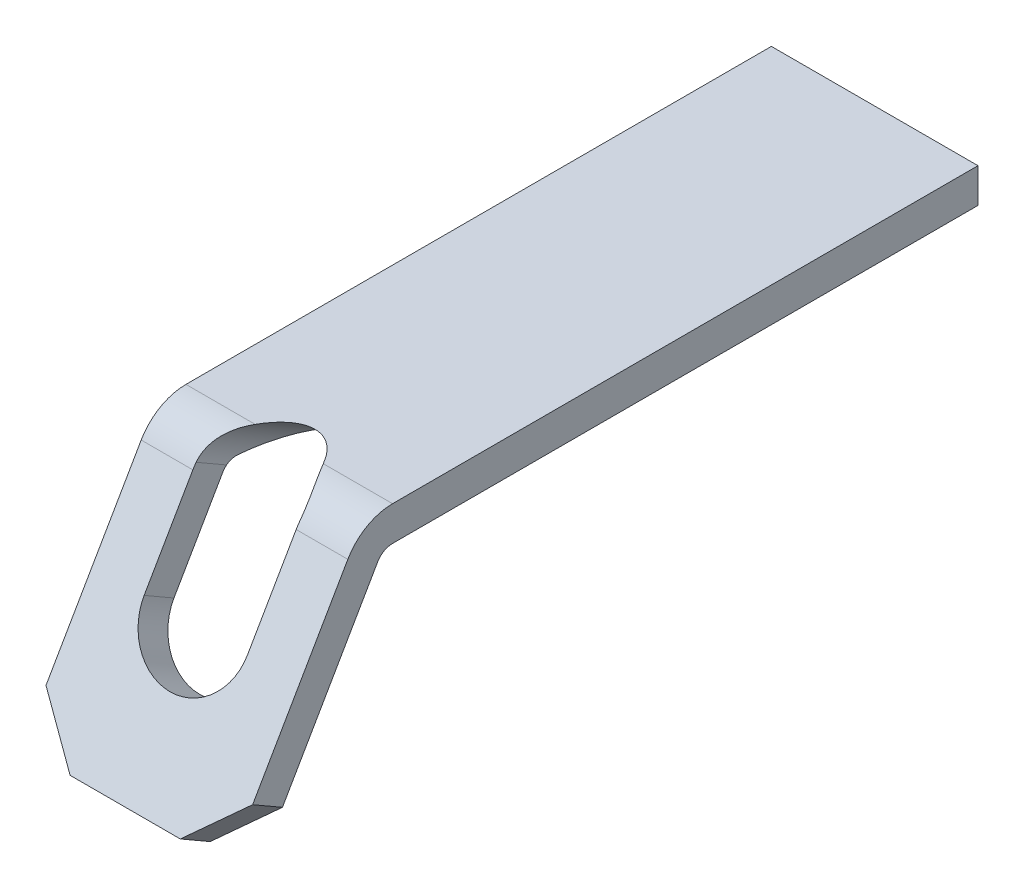
ISO-10303-21;
HEADER;
FILE_DESCRIPTION(('STEP AP214'),'2;1');
FILE_NAME('part.step','',(''),(''),'','','');
FILE_SCHEMA(('AUTOMOTIVE_DESIGN { 1 0 10303 214 1 1 1 1 }'));
ENDSEC;
DATA;
#1=APPLICATION_CONTEXT('core data for automotive mechanical design processes');
#2=APPLICATION_PROTOCOL_DEFINITION('international standard','automotive_design',2000,#1);
#3=PRODUCT_CONTEXT('',#1,'mechanical');
#4=PRODUCT('Part','Part','',(#3));
#5=PRODUCT_RELATED_PRODUCT_CATEGORY('part','',(#4));
#6=PRODUCT_DEFINITION_FORMATION('','',#4);
#7=PRODUCT_DEFINITION_CONTEXT('part definition',#1,'design');
#8=PRODUCT_DEFINITION('design','',#6,#7);
#9=PRODUCT_DEFINITION_SHAPE('','',#8);
#10=(LENGTH_UNIT() NAMED_UNIT(*) SI_UNIT(.MILLI.,.METRE.));
#11=(NAMED_UNIT(*) PLANE_ANGLE_UNIT() SI_UNIT($,.RADIAN.));
#12=(NAMED_UNIT(*) SI_UNIT($,.STERADIAN.) SOLID_ANGLE_UNIT());
#13=UNCERTAINTY_MEASURE_WITH_UNIT(LENGTH_MEASURE(1.E-05),#10,'distance_accuracy_value','');
#14=(GEOMETRIC_REPRESENTATION_CONTEXT(3) GLOBAL_UNCERTAINTY_ASSIGNED_CONTEXT((#13)) GLOBAL_UNIT_ASSIGNED_CONTEXT((#10,
#11,#12)) REPRESENTATION_CONTEXT('',''));
#15=CARTESIAN_POINT('',(0.,0.,0.));
#16=DIRECTION('',(0.,0.,1.));
#17=DIRECTION('',(1.,0.,0.));
#18=AXIS2_PLACEMENT_3D('',#15,#16,#17);
#19=CARTESIAN_POINT('',(1.5,-0.125,4.89951905283833));
#20=DIRECTION('',(0.,0.500000000000001,0.866025403784438));
#21=DIRECTION('',(0.,-0.866025403784438,0.500000000000001));
#22=AXIS2_PLACEMENT_3D('',#19,#20,#21);
#23=PLANE('',#22);
#24=DIRECTION('',(0.,0.866025403784438,-0.500000000000001));
#25=VECTOR('',#24,1.);
#26=CARTESIAN_POINT('',(-1.5,-2.51878221735089,6.28156986040721));
#27=LINE('',#26,#25);
#28=CARTESIAN_POINT('',(-1.5,-2.51878221735089,6.28156986040721));
#29=VERTEX_POINT('',#28);
#30=CARTESIAN_POINT('',(-1.5,-0.125,4.89951905283833));
#31=VERTEX_POINT('',#30);
#32=EDGE_CURVE('E139',#29,#31,#27,.T.);
#33=ORIENTED_EDGE('',*,*,#32,.F.);
#34=DIRECTION('',(0.707106781186546,-0.612372435695796,0.353553390593275));
#35=VECTOR('',#34,1.);
#36=CARTESIAN_POINT('',(-1.5,-2.51878221735089,6.28156986040721));
#37=LINE('',#36,#35);
#38=CARTESIAN_POINT('',(-0.799999999999998,-3.125,6.63156986040721));
#39=VERTEX_POINT('',#38);
#40=EDGE_CURVE('E153',#29,#39,#37,.T.);
#41=ORIENTED_EDGE('',*,*,#40,.T.);
#42=DIRECTION('',(1.,0.,0.));
#43=VECTOR('',#42,1.);
#44=CARTESIAN_POINT('',(0.,-3.125,6.63156986040721));
#45=LINE('',#44,#43);
#46=CARTESIAN_POINT('',(0.8,-3.125,6.63156986040721));
#47=VERTEX_POINT('',#46);
#48=EDGE_CURVE('E160',#47,#39,#45,.F.);
#49=ORIENTED_EDGE('',*,*,#48,.F.);
#50=DIRECTION('',(0.707106781186546,0.612372435695795,-0.353553390593276));
#51=VECTOR('',#50,1.);
#52=CARTESIAN_POINT('',(0.8,-3.125,6.63156986040721));
#53=LINE('',#52,#51);
#54=CARTESIAN_POINT('',(1.5,-2.51878221735089,6.28156986040721));
#55=VERTEX_POINT('',#54);
#56=EDGE_CURVE('E166',#47,#55,#53,.T.);
#57=ORIENTED_EDGE('',*,*,#56,.T.);
#58=DIRECTION('',(0.,-0.866025403784438,0.500000000000001));
#59=VECTOR('',#58,1.);
#60=CARTESIAN_POINT('',(1.5,-0.125000000000001,4.89951905283833));
#61=LINE('',#60,#59);
#62=CARTESIAN_POINT('',(1.5,-0.125,4.89951905283833));
#63=VERTEX_POINT('',#62);
#64=EDGE_CURVE('E152',#63,#55,#61,.T.);
#65=ORIENTED_EDGE('',*,*,#64,.F.);
#66=DIRECTION('',(1.,0.,0.));
#67=VECTOR('',#66,1.);
#68=CARTESIAN_POINT('',(1.5,-0.125000000000001,4.89951905283833));
#69=LINE('',#68,#67);
#70=CARTESIAN_POINT('',(0.75,-0.125,4.89951905283833));
#71=VERTEX_POINT('',#70);
#72=EDGE_CURVE('E144',#63,#71,#69,.F.);
#73=ORIENTED_EDGE('',*,*,#72,.T.);
#74=DIRECTION('',(0.,-0.866025403784438,0.500000000000001));
#75=VECTOR('',#74,1.);
#76=CARTESIAN_POINT('',(0.75,-0.125,4.89951905283833));
#77=LINE('',#76,#75);
#78=CARTESIAN_POINT('',(0.75,-1.3496479222419,5.60656986040721));
#79=VERTEX_POINT('',#78);
#80=EDGE_CURVE('E129',#71,#79,#77,.T.);
#81=ORIENTED_EDGE('',*,*,#80,.T.);
#82=CARTESIAN_POINT('',(0.,-1.3496479222419,5.60656986040721));
#83=DIRECTION('',(0.,0.500000000000001,0.866025403784438));
#84=DIRECTION('',(0.,-0.866025403784438,0.500000000000001));
#85=AXIS2_PLACEMENT_3D('',#82,#83,#84);
#86=CIRCLE('',#85,0.75);
#87=CARTESIAN_POINT('',(-0.75,-1.3496479222419,5.60656986040721));
#88=VERTEX_POINT('',#87);
#89=EDGE_CURVE('E20',#79,#88,#86,.F.);
#90=ORIENTED_EDGE('',*,*,#89,.T.);
#91=DIRECTION('',(0.,-0.866025403784438,0.500000000000001));
#92=VECTOR('',#91,1.);
#93=CARTESIAN_POINT('',(-0.75,-0.125,4.89951905283833));
#94=LINE('',#93,#92);
#95=CARTESIAN_POINT('',(-0.75,-0.125,4.89951905283833));
#96=VERTEX_POINT('',#95);
#97=EDGE_CURVE('E117',#88,#96,#94,.F.);
#98=ORIENTED_EDGE('',*,*,#97,.T.);
#99=DIRECTION('',(1.,0.,0.));
#100=VECTOR('',#99,1.);
#101=CARTESIAN_POINT('',(1.5,-0.125000000000001,4.89951905283833));
#102=LINE('',#101,#100);
#103=EDGE_CURVE('E150',#96,#31,#102,.F.);
#104=ORIENTED_EDGE('',*,*,#103,.T.);
#105=EDGE_LOOP('',(#33,#41,#49,#57,#65,#73,#81,#90,#98,#104));
#106=FACE_BOUND('',#105,.T.);
#107=ADVANCED_FACE('F17',(#106),#23,.T.);
#108=CARTESIAN_POINT('',(0.8,-3.25,6.4150635094611));
#109=DIRECTION('',(-0.707106781186549,0.612372435695793,-0.353553390593274));
#110=DIRECTION('',(-0.654653670707975,-0.755928946018456,0.));
#111=AXIS2_PLACEMENT_3D('',#108,#109,#110);
#112=PLANE('',#111);
#113=DIRECTION('',(0.,-0.500000000000001,-0.866025403784438));
#114=VECTOR('',#113,1.);
#115=CARTESIAN_POINT('',(1.5,-2.51878221735089,6.28156986040721));
#116=LINE('',#115,#114);
#117=CARTESIAN_POINT('',(1.5,-2.76878221735089,5.84855715851499));
#118=VERTEX_POINT('',#117);
#119=EDGE_CURVE('E169',#55,#118,#116,.T.);
#120=ORIENTED_EDGE('',*,*,#119,.F.);
#121=ORIENTED_EDGE('',*,*,#56,.F.);
#122=DIRECTION('',(0.,-0.500000000000001,-0.866025403784438));
#123=VECTOR('',#122,1.);
#124=CARTESIAN_POINT('',(0.8,-3.25,6.4150635094611));
#125=LINE('',#124,#123);
#126=CARTESIAN_POINT('',(0.799999999999999,-3.375,6.198557158515));
#127=VERTEX_POINT('',#126);
#128=EDGE_CURVE('E163',#127,#47,#125,.F.);
#129=ORIENTED_EDGE('',*,*,#128,.F.);
#130=DIRECTION('',(-0.707106781186546,-0.612372435695796,0.353553390593275));
#131=VECTOR('',#130,1.);
#132=CARTESIAN_POINT('',(1.5,-2.76878221735089,5.84855715851499));
#133=LINE('',#132,#131);
#134=EDGE_CURVE('E296',#118,#127,#133,.T.);
#135=ORIENTED_EDGE('',*,*,#134,.F.);
#136=EDGE_LOOP('',(#120,#121,#129,#135));
#137=FACE_BOUND('',#136,.T.);
#138=ADVANCED_FACE('F338',(#137),#112,.F.);
#139=CARTESIAN_POINT('',(0.,-3.25,6.4150635094611));
#140=DIRECTION('',(0.,-0.866025403784438,0.500000000000001));
#141=DIRECTION('',(0.,-0.500000000000001,-0.866025403784438));
#142=AXIS2_PLACEMENT_3D('',#139,#140,#141);
#143=PLANE('',#142);
#144=ORIENTED_EDGE('',*,*,#48,.T.);
#145=DIRECTION('',(0.,-0.500000000000001,-0.866025403784438));
#146=VECTOR('',#145,1.);
#147=CARTESIAN_POINT('',(-0.799999999999998,-3.125,6.63156986040721));
#148=LINE('',#147,#146);
#149=CARTESIAN_POINT('',(-0.799999999999998,-3.375,6.198557158515));
#150=VERTEX_POINT('',#149);
#151=EDGE_CURVE('E157',#39,#150,#148,.T.);
#152=ORIENTED_EDGE('',*,*,#151,.T.);
#153=DIRECTION('',(1.,0.,0.));
#154=VECTOR('',#153,1.);
#155=CARTESIAN_POINT('',(-1.5,-3.375,6.198557158515));
#156=LINE('',#155,#154);
#157=EDGE_CURVE('E287',#127,#150,#156,.F.);
#158=ORIENTED_EDGE('',*,*,#157,.F.);
#159=ORIENTED_EDGE('',*,*,#128,.T.);
#160=EDGE_LOOP('',(#144,#152,#158,#159));
#161=FACE_BOUND('',#160,.T.);
#162=ADVANCED_FACE('F418',(#161),#143,.T.);
#163=CARTESIAN_POINT('',(-0.799999999999998,-3.25,6.4150635094611));
#164=DIRECTION('',(0.707106781186549,0.612372435695793,-0.353553390593274));
#165=DIRECTION('',(-0.654653670707975,0.755928946018456,0.));
#166=AXIS2_PLACEMENT_3D('',#163,#164,#165);
#167=PLANE('',#166);
#168=DIRECTION('',(0.,0.500000000000001,0.866025403784438));
#169=VECTOR('',#168,1.);
#170=CARTESIAN_POINT('',(-1.5,-2.76878221735089,5.84855715851499));
#171=LINE('',#170,#169);
#172=CARTESIAN_POINT('',(-1.5,-2.76878221735089,5.84855715851499));
#173=VERTEX_POINT('',#172);
#174=EDGE_CURVE('E156',#173,#29,#171,.T.);
#175=ORIENTED_EDGE('',*,*,#174,.F.);
#176=DIRECTION('',(-0.707106781186545,0.612372435695796,-0.353553390593275));
#177=VECTOR('',#176,1.);
#178=CARTESIAN_POINT('',(-0.799999999999998,-3.375,6.198557158515));
#179=LINE('',#178,#177);
#180=EDGE_CURVE('E284',#150,#173,#179,.T.);
#181=ORIENTED_EDGE('',*,*,#180,.F.);
#182=ORIENTED_EDGE('',*,*,#151,.F.);
#183=ORIENTED_EDGE('',*,*,#40,.F.);
#184=EDGE_LOOP('',(#175,#181,#182,#183));
#185=FACE_BOUND('',#184,.T.);
#186=ADVANCED_FACE('F416',(#185),#167,.F.);
#187=CARTESIAN_POINT('',(0.75,-4.82496778264912,-3.41286071037125));
#188=DIRECTION('',(1.,0.,0.));
#189=DIRECTION('',(0.,0.,-1.));
#190=AXIS2_PLACEMENT_3D('',#187,#188,#189);
#191=PLANE('',#190);
#192=DIRECTION('',(0.,0.5,0.866025403784439));
#193=VECTOR('',#192,1.);
#194=CARTESIAN_POINT('',(0.75,-0.308220009215908,4.41037591818866));
#195=LINE('',#194,#193);
#196=CARTESIAN_POINT('',(0.75,-0.308220009215908,4.41037591818866));
#197=VERTEX_POINT('',#196);
#198=CARTESIAN_POINT('',(0.75,-0.0530774463347996,4.85229580027207));
#199=VERTEX_POINT('',#198);
#200=EDGE_CURVE('E271',#197,#199,#195,.T.);
#201=ORIENTED_EDGE('',*,*,#200,.F.);
#202=CARTESIAN_POINT('',(0.75,-0.5,4.25));
#203=DIRECTION('',(1.,0.,0.));
#204=DIRECTION('',(0.,0.,-1.));
#205=AXIS2_PLACEMENT_3D('',#202,#203,#204);
#206=CIRCLE('',#205,0.25);
#207=CARTESIAN_POINT('',(0.75,-0.375,4.46650635094611));
#208=VERTEX_POINT('',#207);
#209=EDGE_CURVE('E138',#208,#197,#206,.F.);
#210=ORIENTED_EDGE('',*,*,#209,.F.);
#211=DIRECTION('',(0.,0.866025403784438,-0.500000000000001));
#212=VECTOR('',#211,1.);
#213=CARTESIAN_POINT('',(0.75,-0.375,4.46650635094611));
#214=LINE('',#213,#212);
#215=CARTESIAN_POINT('',(0.75,-1.5996479222419,5.17355715851499));
#216=VERTEX_POINT('',#215);
#217=EDGE_CURVE('E136',#216,#208,#214,.T.);
#218=ORIENTED_EDGE('',*,*,#217,.F.);
#219=DIRECTION('',(0.,-0.500000000000002,-0.866025403784438));
#220=VECTOR('',#219,1.);
#221=CARTESIAN_POINT('',(0.75,-1.3496479222419,5.60656986040721));
#222=LINE('',#221,#220);
#223=EDGE_CURVE('E124',#79,#216,#222,.T.);
#224=ORIENTED_EDGE('',*,*,#223,.F.);
#225=ORIENTED_EDGE('',*,*,#80,.F.);
#226=CARTESIAN_POINT('',(0.75,-0.5,4.25));
#227=DIRECTION('',(1.,0.,0.));
#228=DIRECTION('',(0.,0.,-1.));
#229=AXIS2_PLACEMENT_3D('',#226,#227,#228);
#230=CIRCLE('',#229,0.75);
#231=EDGE_CURVE('E269',#199,#71,#230,.T.);
#232=ORIENTED_EDGE('',*,*,#231,.F.);
#233=EDGE_LOOP('',(#201,#210,#218,#224,#225,#232));
#234=FACE_BOUND('',#233,.T.);
#235=ADVANCED_FACE('F132',(#234),#191,.F.);
#236=CARTESIAN_POINT('',(0.,-6.12400588832578,-2.66286071037124));
#237=DIRECTION('',(0.,0.500000000000001,0.866025403784438));
#238=DIRECTION('',(0.,-0.866025403784438,0.500000000000001));
#239=AXIS2_PLACEMENT_3D('',#236,#237,#238);
#240=CYLINDRICAL_SURFACE('',#239,0.75);
#241=CARTESIAN_POINT('',(0.,-1.5996479222419,5.17355715851499));
#242=DIRECTION('',(0.,0.500000000000001,0.866025403784438));
#243=DIRECTION('',(0.,-0.866025403784438,0.500000000000001));
#244=AXIS2_PLACEMENT_3D('',#241,#242,#243);
#245=CIRCLE('',#244,0.75);
#246=CARTESIAN_POINT('',(-0.75,-1.5996479222419,5.17355715851499));
#247=VERTEX_POINT('',#246);
#248=EDGE_CURVE('E266',#247,#216,#245,.T.);
#249=ORIENTED_EDGE('',*,*,#248,.F.);
#250=DIRECTION('',(0.,0.5,0.866025403784438));
#251=VECTOR('',#250,1.);
#252=CARTESIAN_POINT('',(-0.75,-1.5996479222419,5.17355715851499));
#253=LINE('',#252,#251);
#254=EDGE_CURVE('E126',#247,#88,#253,.T.);
#255=ORIENTED_EDGE('',*,*,#254,.T.);
#256=ORIENTED_EDGE('',*,*,#89,.F.);
#257=ORIENTED_EDGE('',*,*,#223,.T.);
#258=EDGE_LOOP('',(#249,#255,#256,#257));
#259=FACE_BOUND('',#258,.T.);
#260=ADVANCED_FACE('F123',(#259),#240,.F.);
#261=CARTESIAN_POINT('',(-1.5,-0.375,4.46650635094611));
#262=DIRECTION('',(0.,-0.500000000000001,-0.866025403784438));
#263=DIRECTION('',(0.,0.866025403784438,-0.500000000000001));
#264=AXIS2_PLACEMENT_3D('',#261,#262,#263);
#265=PLANE('',#264);
#266=ORIENTED_EDGE('',*,*,#217,.T.);
#267=DIRECTION('',(1.,0.,0.));
#268=VECTOR('',#267,1.);
#269=CARTESIAN_POINT('',(0.,-0.375,4.46650635094611));
#270=LINE('',#269,#268);
#271=CARTESIAN_POINT('',(1.5,-0.375,4.46650635094611));
#272=VERTEX_POINT('',#271);
#273=EDGE_CURVE('E225',#208,#272,#270,.T.);
#274=ORIENTED_EDGE('',*,*,#273,.T.);
#275=DIRECTION('',(0.,0.866025403784438,-0.500000000000001));
#276=VECTOR('',#275,1.);
#277=CARTESIAN_POINT('',(1.5,-0.375,4.46650635094611));
#278=LINE('',#277,#276);
#279=EDGE_CURVE('E270',#272,#118,#278,.F.);
#280=ORIENTED_EDGE('',*,*,#279,.T.);
#281=ORIENTED_EDGE('',*,*,#134,.T.);
#282=ORIENTED_EDGE('',*,*,#157,.T.);
#283=ORIENTED_EDGE('',*,*,#180,.T.);
#284=DIRECTION('',(0.,0.866025403784438,-0.500000000000001));
#285=VECTOR('',#284,1.);
#286=CARTESIAN_POINT('',(-1.5,-0.375,4.46650635094611));
#287=LINE('',#286,#285);
#288=CARTESIAN_POINT('',(-1.5,-0.375,4.46650635094611));
#289=VERTEX_POINT('',#288);
#290=EDGE_CURVE('E268',#173,#289,#287,.T.);
#291=ORIENTED_EDGE('',*,*,#290,.T.);
#292=DIRECTION('',(1.,0.,0.));
#293=VECTOR('',#292,1.);
#294=CARTESIAN_POINT('',(0.,-0.375,4.46650635094611));
#295=LINE('',#294,#293);
#296=CARTESIAN_POINT('',(-0.75,-0.375,4.46650635094611));
#297=VERTEX_POINT('',#296);
#298=EDGE_CURVE('E224',#289,#297,#295,.T.);
#299=ORIENTED_EDGE('',*,*,#298,.T.);
#300=DIRECTION('',(0.,-0.866025403784438,0.500000000000001));
#301=VECTOR('',#300,1.);
#302=CARTESIAN_POINT('',(-0.75,-0.375,4.46650635094611));
#303=LINE('',#302,#301);
#304=EDGE_CURVE('E352',#297,#247,#303,.T.);
#305=ORIENTED_EDGE('',*,*,#304,.T.);
#306=ORIENTED_EDGE('',*,*,#248,.T.);
#307=EDGE_LOOP('',(#266,#274,#280,#281,#282,#283,#291,#299,#305,#306));
#308=FACE_BOUND('',#307,.T.);
#309=ADVANCED_FACE('F343',(#308),#265,.T.);
#310=CARTESIAN_POINT('',(-0.75,-4.82496778264912,-3.41286071037125));
#311=DIRECTION('',(-1.,0.,0.));
#312=DIRECTION('',(0.,-1.,0.));
#313=AXIS2_PLACEMENT_3D('',#310,#311,#312);
#314=PLANE('',#313);
#315=ORIENTED_EDGE('',*,*,#97,.F.);
#316=ORIENTED_EDGE('',*,*,#254,.F.);
#317=ORIENTED_EDGE('',*,*,#304,.F.);
#318=CARTESIAN_POINT('',(-0.75,-0.5,4.25));
#319=DIRECTION('',(1.,0.,0.));
#320=DIRECTION('',(0.,0.,-1.));
#321=AXIS2_PLACEMENT_3D('',#318,#319,#320);
#322=CIRCLE('',#321,0.25);
#323=CARTESIAN_POINT('',(-0.75,-0.308220009215908,4.41037591818866));
#324=VERTEX_POINT('',#323);
#325=EDGE_CURVE('E200',#297,#324,#322,.F.);
#326=ORIENTED_EDGE('',*,*,#325,.T.);
#327=DIRECTION('',(0.,0.500000000000001,0.866025403784438));
#328=VECTOR('',#327,1.);
#329=CARTESIAN_POINT('',(-0.75,-4.82496778264912,-3.41286071037125));
#330=LINE('',#329,#328);
#331=CARTESIAN_POINT('',(-0.75,-0.0530774463347984,4.85229580027207));
#332=VERTEX_POINT('',#331);
#333=EDGE_CURVE('E263',#324,#332,#330,.T.);
#334=ORIENTED_EDGE('',*,*,#333,.T.);
#335=CARTESIAN_POINT('',(-0.75,-0.5,4.25));
#336=DIRECTION('',(1.,0.,0.));
#337=DIRECTION('',(0.,0.,-1.));
#338=AXIS2_PLACEMENT_3D('',#335,#336,#337);
#339=CIRCLE('',#338,0.75);
#340=EDGE_CURVE('E264',#96,#332,#339,.F.);
#341=ORIENTED_EDGE('',*,*,#340,.F.);
#342=EDGE_LOOP('',(#315,#316,#317,#326,#334,#341));
#343=FACE_BOUND('',#342,.T.);
#344=ADVANCED_FACE('F471',(#343),#314,.F.);
#345=CARTESIAN_POINT('',(0.,-4.82496778264912,-3.41286071037125));
#346=DIRECTION('',(0.,0.500000000000001,0.866025403784438));
#347=DIRECTION('',(0.,-0.866025403784438,0.500000000000001));
#348=AXIS2_PLACEMENT_3D('',#345,#346,#347);
#349=CYLINDRICAL_SURFACE('',#348,0.75);
#350=ORIENTED_EDGE('',*,*,#200,.T.);
#351=CARTESIAN_POINT('',(0.494804752028707,0.25,4.25));
#352=CARTESIAN_POINT('',(0.507212223849995,0.249991049365019,4.27176544478382));
#353=CARTESIAN_POINT('',(0.519677329562981,0.249052174133644,4.29348153759597));
#354=CARTESIAN_POINT('',(0.544476505895984,0.245273819176751,4.33686353730328));
#355=CARTESIAN_POINT('',(0.556810364065535,0.242431628285438,4.35852932830796));
#356=CARTESIAN_POINT('',(0.593492984985001,0.230897623169133,4.42397071088134));
#357=CARTESIAN_POINT('',(0.617199549117096,0.219196023208875,4.46764754407431));
#358=CARTESIAN_POINT('',(0.655369353049871,0.191156681794535,4.54326612847591));
#359=CARTESIAN_POINT('',(0.670675057728904,0.176653514513336,4.57546468892482));
#360=CARTESIAN_POINT('',(0.697958612412823,0.142647605295805,4.63828922937357));
#361=CARTESIAN_POINT('',(0.70996212874235,0.123185827280292,4.66892573721418));
#362=CARTESIAN_POINT('',(0.729340509733132,0.0800406667948661,4.72675752132392));
#363=CARTESIAN_POINT('',(0.736878604418718,0.0565530386505965,4.75404068185705));
#364=CARTESIAN_POINT('',(0.744635583122395,0.0179834450445745,4.79270929564723));
#365=CARTESIAN_POINT('',(0.746630830911752,0.0044493651240266,4.80531366677174));
#366=CARTESIAN_POINT('',(0.749315579530813,-0.0236048687245396,4.82956257178275));
#367=CARTESIAN_POINT('',(0.750003338619623,-0.0381263113268374,4.84120580560175));
#368=CARTESIAN_POINT('',(0.75,-0.0530774463347997,4.85229580027207));
#369=B_SPLINE_CURVE_WITH_KNOTS('',3,(#351,#352,#353,#354,#355,#356,#357,#358,#359,#360,#361,
#362,#363,#364,#365,#366,#367,#368),.UNSPECIFIED.,.F.,.F.,(4,2,2,2,2,2,2,2,4),(0.,
0.0751135104377851,0.150334244069227,0.30265178558994,0.417705443137113,0.531837811097345,
0.641489009411776,0.697207014432037,0.752999191038593),.UNSPECIFIED.);
#370=CARTESIAN_POINT('',(0.494804752028707,0.25,4.25));
#371=VERTEX_POINT('',#370);
#372=EDGE_CURVE('E226',#371,#199,#369,.T.);
#373=ORIENTED_EDGE('',*,*,#372,.F.);
#374=CARTESIAN_POINT('',(0.,0.25,5.37724133595217));
#375=DIRECTION('',(0.,1.,0.));
#376=DIRECTION('',(0.,0.,1.));
#377=AXIS2_PLACEMENT_3D('',#374,#375,#376);
#378=ELLIPSE('',#377,1.5,0.75);
#379=CARTESIAN_POINT('',(-0.494804752028707,0.25,4.25));
#380=VERTEX_POINT('',#379);
#381=EDGE_CURVE('E233',#380,#371,#378,.F.);
#382=ORIENTED_EDGE('',*,*,#381,.F.);
#383=CARTESIAN_POINT('',(-0.75,-0.0530774463347996,4.85229580027207));
#384=CARTESIAN_POINT('',(-0.750002475309162,-0.0390500007812537,4.84189012408484));
#385=CARTESIAN_POINT('',(-0.749397484850659,-0.0253996458116004,4.83099771523583));
#386=CARTESIAN_POINT('',(-0.747030547301498,0.0010400697193072,4.8083555069125));
#387=CARTESIAN_POINT('',(-0.745269813605595,0.0138303177827559,4.79660661812892));
#388=CARTESIAN_POINT('',(-0.738388136393959,0.050530871912727,4.7604737016062));
#389=CARTESIAN_POINT('',(-0.731665075692414,0.0730740166895005,4.73497676608455));
#390=CARTESIAN_POINT('',(-0.714670479663493,0.113924752364808,4.68210224166803));
#391=CARTESIAN_POINT('',(-0.704412929418582,0.132248568388785,4.65473240041221));
#392=CARTESIAN_POINT('',(-0.681092480512218,0.164811508788652,4.59868326911695));
#393=CARTESIAN_POINT('',(-0.668020265449992,0.179036692146175,4.56999988576025));
#394=CARTESIAN_POINT('',(-0.633617683474331,0.2088635379017,4.49914580377907));
#395=CARTESIAN_POINT('',(-0.611187373419911,0.222307050936848,4.45660414355653));
#396=CARTESIAN_POINT('',(-0.564129396140942,0.241456718121171,4.37110856302409));
#397=CARTESIAN_POINT('',(-0.539503361307708,0.247168570016325,4.3281549698181));
#398=CARTESIAN_POINT('',(-0.508168812013808,0.249724148600027,4.27340370863223));
#399=CARTESIAN_POINT('',(-0.50147653812417,0.249996949131605,4.26170462495713));
#400=CARTESIAN_POINT('',(-0.494804752028711,0.250000000000005,4.25));
#401=B_SPLINE_CURVE_WITH_KNOTS('',3,(#383,#384,#385,#386,#387,#388,#389,#390,#391,#392,#393,
#394,#395,#396,#397,#398,#399,#400),.UNSPECIFIED.,.F.,.F.,(4,2,2,2,2,2,2,2,4),(0.,
0.0523524240966636,0.104649972016483,0.208128032232243,0.311201270134959,0.414621068926401,
0.563636486235142,0.712542028697262,0.752971410406566),.UNSPECIFIED.);
#402=EDGE_CURVE('E257',#332,#380,#401,.T.);
#403=ORIENTED_EDGE('',*,*,#402,.F.);
#404=ORIENTED_EDGE('',*,*,#333,.F.);
#405=CARTESIAN_POINT('',(-0.75,-0.308220009215909,4.41037591818866));
#406=CARTESIAN_POINT('',(-0.750008310530122,-0.299170345690206,4.39957110118343));
#407=CARTESIAN_POINT('',(-0.7496493719506,-0.291061551564701,4.38799997393136));
#408=CARTESIAN_POINT('',(-0.748415678099863,-0.277104423632904,4.36403100034418));
#409=CARTESIAN_POINT('',(-0.747555891577427,-0.271198332145318,4.35166604883466));
#410=CARTESIAN_POINT('',(-0.745421239101967,-0.261037124809497,4.32496342703673));
#411=CARTESIAN_POINT('',(-0.744115010283401,-0.256988760900442,4.31054949871758));
#412=CARTESIAN_POINT('',(-0.741355473168162,-0.25142101625551,4.28077071335262));
#413=CARTESIAN_POINT('',(-0.739898791250124,-0.249986913345264,4.26539018443887));
#414=CARTESIAN_POINT('',(-0.738540154084689,-0.25,4.25));
#415=B_SPLINE_CURVE_WITH_KNOTS('',3,(#405,#406,#407,#408,#409,#410,#411,#412,#413,#414),
.UNSPECIFIED.,.F.,.F.,(4,2,2,2,4),(0.,0.0422016336722637,0.0832023760305242,0.128047888733356,
0.174331752280167),.UNSPECIFIED.);
#416=CARTESIAN_POINT('',(-0.738540154084689,-0.25,4.25));
#417=VERTEX_POINT('',#416);
#418=EDGE_CURVE('E192',#324,#417,#415,.T.);
#419=ORIENTED_EDGE('',*,*,#418,.T.);
#420=CARTESIAN_POINT('',(0.,-0.25,4.51121593216774));
#421=DIRECTION('',(0.,1.,0.));
#422=DIRECTION('',(0.,0.,1.));
#423=AXIS2_PLACEMENT_3D('',#420,#421,#422);
#424=ELLIPSE('',#423,1.5,0.75);
#425=CARTESIAN_POINT('',(0.738540154084688,-0.25,4.25));
#426=VERTEX_POINT('',#425);
#427=EDGE_CURVE('E189',#417,#426,#424,.F.);
#428=ORIENTED_EDGE('',*,*,#427,.T.);
#429=CARTESIAN_POINT('',(0.738540154084688,-0.25,4.25));
#430=CARTESIAN_POINT('',(0.739796227190586,-0.249992222476748,4.26423192600012));
#431=CARTESIAN_POINT('',(0.741136393695475,-0.251215674942695,4.27845228618072));
#432=CARTESIAN_POINT('',(0.743704492818735,-0.255982139403661,4.30608304503192));
#433=CARTESIAN_POINT('',(0.744934546425551,-0.2594573169147,4.31950497559517));
#434=CARTESIAN_POINT('',(0.747172335123278,-0.268891956089954,4.34646595481917));
#435=CARTESIAN_POINT('',(0.748160348429003,-0.27499860728258,4.35995559261057));
#436=CARTESIAN_POINT('',(0.749588900459598,-0.289725386987503,4.38608332336731));
#437=CARTESIAN_POINT('',(0.750011148585141,-0.298418856822307,4.3986810266524));
#438=CARTESIAN_POINT('',(0.75,-0.308220009215908,4.41037591818866));
#439=B_SPLINE_CURVE_WITH_KNOTS('',3,(#429,#430,#431,#432,#433,#434,#435,#436,#437,#438),
.UNSPECIFIED.,.F.,.F.,(4,2,2,2,4),(0.,0.0428026914059938,0.0843723717900828,0.128652135829096,
0.174331417159321),.UNSPECIFIED.);
#440=EDGE_CURVE('E217',#426,#197,#439,.T.);
#441=ORIENTED_EDGE('',*,*,#440,.T.);
#442=EDGE_LOOP('',(#350,#373,#382,#403,#404,#419,#428,#441));
#443=FACE_BOUND('',#442,.T.);
#444=ADVANCED_FACE('F202',(#443),#349,.F.);
#445=CARTESIAN_POINT('',(0.,-0.5,4.25));
#446=DIRECTION('',(1.,0.,0.));
#447=DIRECTION('',(0.,0.,-1.));
#448=AXIS2_PLACEMENT_3D('',#445,#446,#447);
#449=CYLINDRICAL_SURFACE('',#448,0.25);
#450=DIRECTION('',(1.,0.,0.));
#451=VECTOR('',#450,1.);
#452=CARTESIAN_POINT('',(0.,-0.25,4.25));
#453=LINE('',#452,#451);
#454=CARTESIAN_POINT('',(1.5,-0.25,4.25));
#455=VERTEX_POINT('',#454);
#456=EDGE_CURVE('E188',#426,#455,#453,.T.);
#457=ORIENTED_EDGE('',*,*,#456,.T.);
#458=CARTESIAN_POINT('',(1.5,-0.5,4.25));
#459=DIRECTION('',(1.,0.,0.));
#460=DIRECTION('',(0.,0.,-1.));
#461=AXIS2_PLACEMENT_3D('',#458,#459,#460);
#462=CIRCLE('',#461,0.25);
#463=EDGE_CURVE('E185',#455,#272,#462,.T.);
#464=ORIENTED_EDGE('',*,*,#463,.T.);
#465=ORIENTED_EDGE('',*,*,#273,.F.);
#466=ORIENTED_EDGE('',*,*,#209,.T.);
#467=ORIENTED_EDGE('',*,*,#440,.F.);
#468=EDGE_LOOP('',(#457,#464,#465,#466,#467));
#469=FACE_BOUND('',#468,.T.);
#470=ADVANCED_FACE('F211',(#469),#449,.F.);
#471=CARTESIAN_POINT('',(0.,-0.5,4.25));
#472=DIRECTION('',(1.,0.,0.));
#473=DIRECTION('',(0.,0.,-1.));
#474=AXIS2_PLACEMENT_3D('',#471,#472,#473);
#475=CYLINDRICAL_SURFACE('',#474,0.25);
#476=ORIENTED_EDGE('',*,*,#325,.F.);
#477=ORIENTED_EDGE('',*,*,#298,.F.);
#478=CARTESIAN_POINT('',(-1.5,-0.5,4.25));
#479=DIRECTION('',(1.,0.,0.));
#480=DIRECTION('',(0.,0.,-1.));
#481=AXIS2_PLACEMENT_3D('',#478,#479,#480);
#482=CIRCLE('',#481,0.25);
#483=CARTESIAN_POINT('',(-1.5,-0.25,4.25));
#484=VERTEX_POINT('',#483);
#485=EDGE_CURVE('E179',#289,#484,#482,.F.);
#486=ORIENTED_EDGE('',*,*,#485,.T.);
#487=DIRECTION('',(1.,0.,0.));
#488=VECTOR('',#487,1.);
#489=CARTESIAN_POINT('',(0.,-0.25,4.25));
#490=LINE('',#489,#488);
#491=EDGE_CURVE('E191',#484,#417,#490,.T.);
#492=ORIENTED_EDGE('',*,*,#491,.T.);
#493=ORIENTED_EDGE('',*,*,#418,.F.);
#494=EDGE_LOOP('',(#476,#477,#486,#492,#493));
#495=FACE_BOUND('',#494,.T.);
#496=ADVANCED_FACE('F206',(#495),#475,.F.);
#497=CARTESIAN_POINT('',(0.,-0.25,0.));
#498=DIRECTION('',(0.,1.,0.));
#499=DIRECTION('',(0.,0.,1.));
#500=AXIS2_PLACEMENT_3D('',#497,#498,#499);
#501=PLANE('',#500);
#502=ORIENTED_EDGE('',*,*,#427,.F.);
#503=ORIENTED_EDGE('',*,*,#491,.F.);
#504=DIRECTION('',(0.,0.,-1.));
#505=VECTOR('',#504,1.);
#506=CARTESIAN_POINT('',(-1.5,-0.25,-4.25));
#507=LINE('',#506,#505);
#508=CARTESIAN_POINT('',(-1.5,-0.25,-4.25));
#509=VERTEX_POINT('',#508);
#510=EDGE_CURVE('E178',#484,#509,#507,.T.);
#511=ORIENTED_EDGE('',*,*,#510,.T.);
#512=DIRECTION('',(1.,0.,0.));
#513=VECTOR('',#512,1.);
#514=CARTESIAN_POINT('',(-1.5,-0.25,-4.25));
#515=LINE('',#514,#513);
#516=CARTESIAN_POINT('',(1.5,-0.25,-4.25));
#517=VERTEX_POINT('',#516);
#518=EDGE_CURVE('E360',#509,#517,#515,.T.);
#519=ORIENTED_EDGE('',*,*,#518,.T.);
#520=DIRECTION('',(0.,0.,1.));
#521=VECTOR('',#520,1.);
#522=CARTESIAN_POINT('',(1.5,-0.25,-4.25));
#523=LINE('',#522,#521);
#524=EDGE_CURVE('E184',#517,#455,#523,.T.);
#525=ORIENTED_EDGE('',*,*,#524,.T.);
#526=ORIENTED_EDGE('',*,*,#456,.F.);
#527=EDGE_LOOP('',(#502,#503,#511,#519,#525,#526));
#528=FACE_BOUND('',#527,.T.);
#529=ADVANCED_FACE('F210',(#528),#501,.F.);
#530=CARTESIAN_POINT('',(0.,-0.5,4.25));
#531=DIRECTION('',(1.,0.,0.));
#532=DIRECTION('',(0.,0.,-1.));
#533=AXIS2_PLACEMENT_3D('',#530,#531,#532);
#534=CYLINDRICAL_SURFACE('',#533,0.75);
#535=CARTESIAN_POINT('',(1.5,-0.5,4.25));
#536=DIRECTION('',(1.,0.,0.));
#537=DIRECTION('',(0.,0.,-1.));
#538=AXIS2_PLACEMENT_3D('',#535,#536,#537);
#539=CIRCLE('',#538,0.75);
#540=CARTESIAN_POINT('',(1.5,0.25,4.25));
#541=VERTEX_POINT('',#540);
#542=EDGE_CURVE('E182',#63,#541,#539,.F.);
#543=ORIENTED_EDGE('',*,*,#542,.T.);
#544=DIRECTION('',(1.,0.,0.));
#545=VECTOR('',#544,1.);
#546=CARTESIAN_POINT('',(0.,0.25,4.25));
#547=LINE('',#546,#545);
#548=EDGE_CURVE('E177',#371,#541,#547,.T.);
#549=ORIENTED_EDGE('',*,*,#548,.F.);
#550=ORIENTED_EDGE('',*,*,#372,.T.);
#551=ORIENTED_EDGE('',*,*,#231,.T.);
#552=ORIENTED_EDGE('',*,*,#72,.F.);
#553=EDGE_LOOP('',(#543,#549,#550,#551,#552));
#554=FACE_BOUND('',#553,.T.);
#555=ADVANCED_FACE('F235',(#554),#534,.T.);
#556=CARTESIAN_POINT('',(1.5,0.25,-4.25));
#557=DIRECTION('',(-1.,0.,0.));
#558=DIRECTION('',(0.,0.,1.));
#559=AXIS2_PLACEMENT_3D('',#556,#557,#558);
#560=PLANE('',#559);
#561=DIRECTION('',(0.,1.,0.));
#562=VECTOR('',#561,1.);
#563=CARTESIAN_POINT('',(1.5,0.25,-4.25));
#564=LINE('',#563,#562);
#565=CARTESIAN_POINT('',(1.5,0.25,-4.25));
#566=VERTEX_POINT('',#565);
#567=EDGE_CURVE('E363',#517,#566,#564,.T.);
#568=ORIENTED_EDGE('',*,*,#567,.T.);
#569=DIRECTION('',(0.,0.,1.));
#570=VECTOR('',#569,1.);
#571=CARTESIAN_POINT('',(1.5,0.25,0.));
#572=LINE('',#571,#570);
#573=EDGE_CURVE('E374',#541,#566,#572,.F.);
#574=ORIENTED_EDGE('',*,*,#573,.F.);
#575=ORIENTED_EDGE('',*,*,#542,.F.);
#576=ORIENTED_EDGE('',*,*,#64,.T.);
#577=ORIENTED_EDGE('',*,*,#119,.T.);
#578=ORIENTED_EDGE('',*,*,#279,.F.);
#579=ORIENTED_EDGE('',*,*,#463,.F.);
#580=ORIENTED_EDGE('',*,*,#524,.F.);
#581=EDGE_LOOP('',(#568,#574,#575,#576,#577,#578,#579,#580));
#582=FACE_BOUND('',#581,.T.);
#583=ADVANCED_FACE('F239',(#582),#560,.F.);
#584=CARTESIAN_POINT('',(-1.5,0.25,-4.25));
#585=DIRECTION('',(0.,0.,1.));
#586=DIRECTION('',(1.,0.,0.));
#587=AXIS2_PLACEMENT_3D('',#584,#585,#586);
#588=PLANE('',#587);
#589=DIRECTION('',(0.,1.,0.));
#590=VECTOR('',#589,1.);
#591=CARTESIAN_POINT('',(-1.5,0.25,-4.25));
#592=LINE('',#591,#590);
#593=CARTESIAN_POINT('',(-1.5,0.25,-4.25));
#594=VERTEX_POINT('',#593);
#595=EDGE_CURVE('E181',#509,#594,#592,.T.);
#596=ORIENTED_EDGE('',*,*,#595,.T.);
#597=DIRECTION('',(1.,0.,0.));
#598=VECTOR('',#597,1.);
#599=CARTESIAN_POINT('',(0.,0.25,-4.25));
#600=LINE('',#599,#598);
#601=EDGE_CURVE('E377',#566,#594,#600,.F.);
#602=ORIENTED_EDGE('',*,*,#601,.F.);
#603=ORIENTED_EDGE('',*,*,#567,.F.);
#604=ORIENTED_EDGE('',*,*,#518,.F.);
#605=EDGE_LOOP('',(#596,#602,#603,#604));
#606=FACE_BOUND('',#605,.T.);
#607=ADVANCED_FACE('F243',(#606),#588,.F.);
#608=CARTESIAN_POINT('',(-1.5,0.25,-4.25));
#609=DIRECTION('',(1.,0.,0.));
#610=DIRECTION('',(0.,0.,-1.));
#611=AXIS2_PLACEMENT_3D('',#608,#609,#610);
#612=PLANE('',#611);
#613=ORIENTED_EDGE('',*,*,#485,.F.);
#614=ORIENTED_EDGE('',*,*,#290,.F.);
#615=ORIENTED_EDGE('',*,*,#174,.T.);
#616=ORIENTED_EDGE('',*,*,#32,.T.);
#617=CARTESIAN_POINT('',(-1.5,-0.5,4.25));
#618=DIRECTION('',(1.,0.,0.));
#619=DIRECTION('',(0.,0.,-1.));
#620=AXIS2_PLACEMENT_3D('',#617,#618,#619);
#621=CIRCLE('',#620,0.75);
#622=CARTESIAN_POINT('',(-1.5,0.25,4.25));
#623=VERTEX_POINT('',#622);
#624=EDGE_CURVE('E35',#623,#31,#621,.T.);
#625=ORIENTED_EDGE('',*,*,#624,.F.);
#626=DIRECTION('',(0.,0.,1.));
#627=VECTOR('',#626,1.);
#628=CARTESIAN_POINT('',(-1.5,0.25,0.));
#629=LINE('',#628,#627);
#630=EDGE_CURVE('E26',#594,#623,#629,.T.);
#631=ORIENTED_EDGE('',*,*,#630,.F.);
#632=ORIENTED_EDGE('',*,*,#595,.F.);
#633=ORIENTED_EDGE('',*,*,#510,.F.);
#634=EDGE_LOOP('',(#613,#614,#615,#616,#625,#631,#632,#633));
#635=FACE_BOUND('',#634,.T.);
#636=ADVANCED_FACE('F247',(#635),#612,.F.);
#637=CARTESIAN_POINT('',(0.,-0.5,4.25));
#638=DIRECTION('',(1.,0.,0.));
#639=DIRECTION('',(0.,0.,-1.));
#640=AXIS2_PLACEMENT_3D('',#637,#638,#639);
#641=CYLINDRICAL_SURFACE('',#640,0.75);
#642=ORIENTED_EDGE('',*,*,#103,.F.);
#643=ORIENTED_EDGE('',*,*,#340,.T.);
#644=ORIENTED_EDGE('',*,*,#402,.T.);
#645=DIRECTION('',(1.,0.,0.));
#646=VECTOR('',#645,1.);
#647=CARTESIAN_POINT('',(0.,0.25,4.25));
#648=LINE('',#647,#646);
#649=EDGE_CURVE('E11',#623,#380,#648,.T.);
#650=ORIENTED_EDGE('',*,*,#649,.F.);
#651=ORIENTED_EDGE('',*,*,#624,.T.);
#652=EDGE_LOOP('',(#642,#643,#644,#650,#651));
#653=FACE_BOUND('',#652,.T.);
#654=ADVANCED_FACE('F251',(#653),#641,.T.);
#655=CARTESIAN_POINT('',(0.,0.25,0.));
#656=DIRECTION('',(0.,1.,0.));
#657=DIRECTION('',(0.,0.,1.));
#658=AXIS2_PLACEMENT_3D('',#655,#656,#657);
#659=PLANE('',#658);
#660=ORIENTED_EDGE('',*,*,#630,.T.);
#661=ORIENTED_EDGE('',*,*,#649,.T.);
#662=ORIENTED_EDGE('',*,*,#381,.T.);
#663=ORIENTED_EDGE('',*,*,#548,.T.);
#664=ORIENTED_EDGE('',*,*,#573,.T.);
#665=ORIENTED_EDGE('',*,*,#601,.T.);
#666=EDGE_LOOP('',(#660,#661,#662,#663,#664,#665));
#667=FACE_BOUND('',#666,.T.);
#668=ADVANCED_FACE('F255',(#667),#659,.T.);
#669=CLOSED_SHELL('',(#107,#138,#162,#186,#235,#260,#309,#344,#444,#470,#496,#529,#555,#583,
#607,#636,#654,#668));
#670=MANIFOLD_SOLID_BREP('B1',#669);
#671=ADVANCED_BREP_SHAPE_REPRESENTATION('',(#18,#670),#14);
#672=SHAPE_DEFINITION_REPRESENTATION(#9,#671);
ENDSEC;
END-ISO-10303-21;
